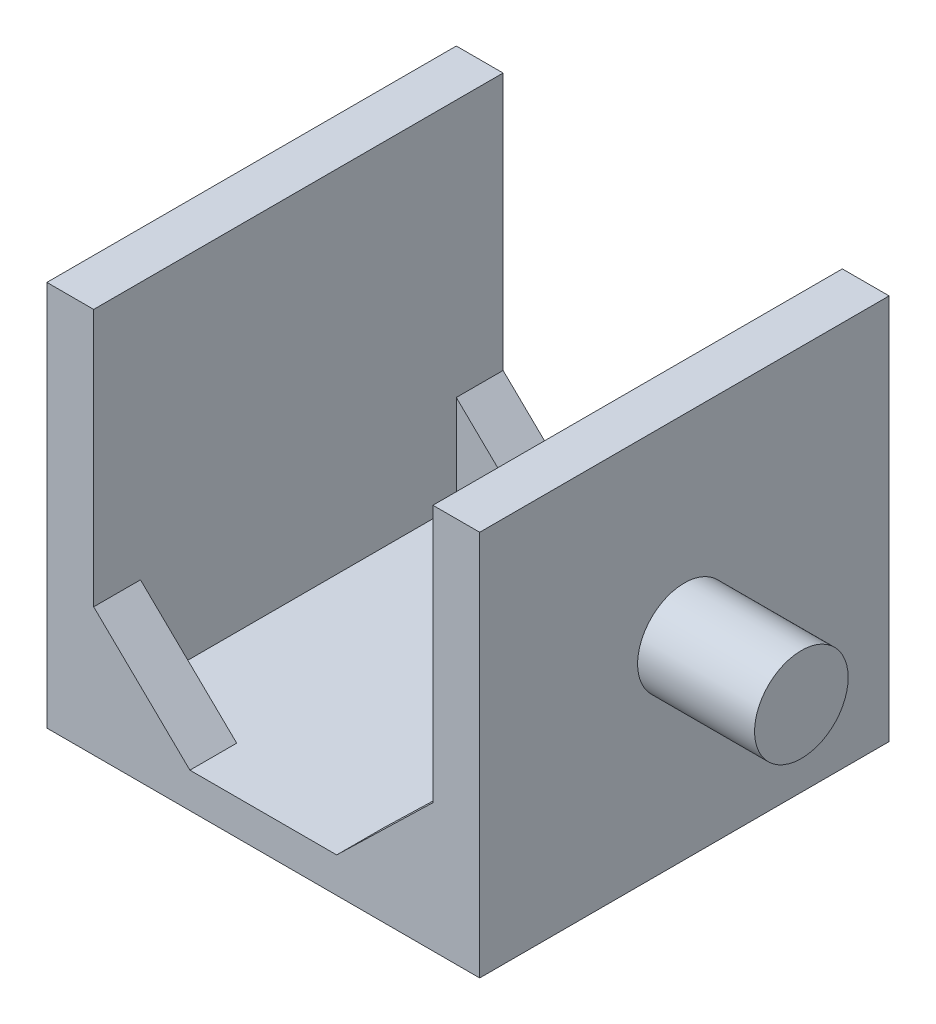
ISO-10303-21;
HEADER;
FILE_DESCRIPTION(('STEP AP214'),'2;1');
FILE_NAME('part.step','',(''),(''),'','','');
FILE_SCHEMA(('AUTOMOTIVE_DESIGN { 1 0 10303 214 1 1 1 1 }'));
ENDSEC;
DATA;
#1=APPLICATION_CONTEXT('core data for automotive mechanical design processes');
#2=APPLICATION_PROTOCOL_DEFINITION('international standard','automotive_design',2000,#1);
#3=PRODUCT_CONTEXT('',#1,'mechanical');
#4=PRODUCT('Part','Part','',(#3));
#5=PRODUCT_RELATED_PRODUCT_CATEGORY('part','',(#4));
#6=PRODUCT_DEFINITION_FORMATION('','',#4);
#7=PRODUCT_DEFINITION_CONTEXT('part definition',#1,'design');
#8=PRODUCT_DEFINITION('design','',#6,#7);
#9=PRODUCT_DEFINITION_SHAPE('','',#8);
#10=(LENGTH_UNIT() NAMED_UNIT(*) SI_UNIT(.MILLI.,.METRE.));
#11=(NAMED_UNIT(*) PLANE_ANGLE_UNIT() SI_UNIT($,.RADIAN.));
#12=(NAMED_UNIT(*) SI_UNIT($,.STERADIAN.) SOLID_ANGLE_UNIT());
#13=UNCERTAINTY_MEASURE_WITH_UNIT(LENGTH_MEASURE(1.E-05),#10,'distance_accuracy_value','');
#14=(GEOMETRIC_REPRESENTATION_CONTEXT(3) GLOBAL_UNCERTAINTY_ASSIGNED_CONTEXT((#13)) GLOBAL_UNIT_ASSIGNED_CONTEXT((#10,
#11,#12)) REPRESENTATION_CONTEXT('',''));
#15=CARTESIAN_POINT('',(0.,0.,0.));
#16=DIRECTION('',(0.,0.,1.));
#17=DIRECTION('',(1.,0.,0.));
#18=AXIS2_PLACEMENT_3D('',#15,#16,#17);
#19=CARTESIAN_POINT('',(0.,3.,0.));
#20=DIRECTION('',(0.,-1.,0.));
#21=DIRECTION('',(0.,0.,-1.));
#22=AXIS2_PLACEMENT_3D('',#19,#20,#21);
#23=PLANE('',#22);
#24=CARTESIAN_POINT('',(0.,3.,0.));
#25=DIRECTION('',(0.,1.,0.));
#26=DIRECTION('',(0.,0.,1.));
#27=AXIS2_PLACEMENT_3D('',#24,#25,#26);
#28=CIRCLE('',#27,2.);
#29=CARTESIAN_POINT('',(0.,3.,2.));
#30=VERTEX_POINT('',#29);
#31=EDGE_CURVE('E311',#30,#30,#28,.T.);
#32=ORIENTED_EDGE('',*,*,#31,.F.);
#33=EDGE_LOOP('',(#32));
#34=FACE_BOUND('',#33,.T.);
#35=DIRECTION('',(-1.,0.,0.));
#36=VECTOR('',#35,1.);
#37=CARTESIAN_POINT('',(6.27292779435015,3.,-13.5));
#38=LINE('',#37,#36);
#39=CARTESIAN_POINT('',(14.5,3.,-13.5));
#40=VERTEX_POINT('',#39);
#41=CARTESIAN_POINT('',(6.27292779435015,3.,-13.5));
#42=VERTEX_POINT('',#41);
#43=EDGE_CURVE('E61',#40,#42,#38,.T.);
#44=ORIENTED_EDGE('',*,*,#43,.T.);
#45=DIRECTION('',(0.,0.,-1.));
#46=VECTOR('',#45,1.);
#47=CARTESIAN_POINT('',(6.27292779435015,3.,-13.5));
#48=LINE('',#47,#46);
#49=CARTESIAN_POINT('',(6.27292779435015,3.,-17.5));
#50=VERTEX_POINT('',#49);
#51=EDGE_CURVE('E174',#42,#50,#48,.T.);
#52=ORIENTED_EDGE('',*,*,#51,.T.);
#53=DIRECTION('',(-1.,0.,0.));
#54=VECTOR('',#53,1.);
#55=CARTESIAN_POINT('',(-18.5,3.,-17.5));
#56=LINE('',#55,#54);
#57=CARTESIAN_POINT('',(-6.27292779435015,3.,-17.5));
#58=VERTEX_POINT('',#57);
#59=EDGE_CURVE('E161',#50,#58,#56,.T.);
#60=ORIENTED_EDGE('',*,*,#59,.T.);
#61=DIRECTION('',(0.,0.,-1.));
#62=VECTOR('',#61,1.);
#63=CARTESIAN_POINT('',(-6.27292779435015,3.,-13.5));
#64=LINE('',#63,#62);
#65=CARTESIAN_POINT('',(-6.27292779435015,3.,-13.5));
#66=VERTEX_POINT('',#65);
#67=EDGE_CURVE('E204',#66,#58,#64,.T.);
#68=ORIENTED_EDGE('',*,*,#67,.F.);
#69=DIRECTION('',(1.,0.,0.));
#70=VECTOR('',#69,1.);
#71=CARTESIAN_POINT('',(-6.27292779435015,3.,-13.5));
#72=LINE('',#71,#70);
#73=CARTESIAN_POINT('',(-14.5,3.,-13.5));
#74=VERTEX_POINT('',#73);
#75=EDGE_CURVE('E198',#74,#66,#72,.T.);
#76=ORIENTED_EDGE('',*,*,#75,.F.);
#77=DIRECTION('',(0.,0.,-1.));
#78=VECTOR('',#77,1.);
#79=CARTESIAN_POINT('',(-14.5,3.,-17.5));
#80=LINE('',#79,#78);
#81=CARTESIAN_POINT('',(-14.5,3.,13.5));
#82=VERTEX_POINT('',#81);
#83=EDGE_CURVE('E273',#82,#74,#80,.T.);
#84=ORIENTED_EDGE('',*,*,#83,.F.);
#85=DIRECTION('',(1.,0.,0.));
#86=VECTOR('',#85,1.);
#87=CARTESIAN_POINT('',(-6.27292779435015,3.,13.5));
#88=LINE('',#87,#86);
#89=CARTESIAN_POINT('',(-6.27292779435015,3.,13.5));
#90=VERTEX_POINT('',#89);
#91=EDGE_CURVE('E234',#82,#90,#88,.T.);
#92=ORIENTED_EDGE('',*,*,#91,.T.);
#93=DIRECTION('',(0.,0.,1.));
#94=VECTOR('',#93,1.);
#95=CARTESIAN_POINT('',(-6.27292779435015,3.,13.5));
#96=LINE('',#95,#94);
#97=CARTESIAN_POINT('',(-6.27292779435015,3.,17.5));
#98=VERTEX_POINT('',#97);
#99=EDGE_CURVE('E241',#90,#98,#96,.T.);
#100=ORIENTED_EDGE('',*,*,#99,.T.);
#101=DIRECTION('',(1.,0.,0.));
#102=VECTOR('',#101,1.);
#103=CARTESIAN_POINT('',(-18.5,3.,17.5));
#104=LINE('',#103,#102);
#105=CARTESIAN_POINT('',(6.27292779435015,3.,17.5));
#106=VERTEX_POINT('',#105);
#107=EDGE_CURVE('E171',#98,#106,#104,.T.);
#108=ORIENTED_EDGE('',*,*,#107,.T.);
#109=DIRECTION('',(0.,0.,1.));
#110=VECTOR('',#109,1.);
#111=CARTESIAN_POINT('',(6.27292779435015,3.,13.5));
#112=LINE('',#111,#110);
#113=CARTESIAN_POINT('',(6.27292779435015,3.,13.5));
#114=VERTEX_POINT('',#113);
#115=EDGE_CURVE('E224',#114,#106,#112,.T.);
#116=ORIENTED_EDGE('',*,*,#115,.F.);
#117=DIRECTION('',(-1.,0.,0.));
#118=VECTOR('',#117,1.);
#119=CARTESIAN_POINT('',(6.27292779435015,3.,13.5));
#120=LINE('',#119,#118);
#121=CARTESIAN_POINT('',(14.5,3.,13.5));
#122=VERTEX_POINT('',#121);
#123=EDGE_CURVE('E218',#122,#114,#120,.T.);
#124=ORIENTED_EDGE('',*,*,#123,.F.);
#125=DIRECTION('',(0.,0.,1.));
#126=VECTOR('',#125,1.);
#127=CARTESIAN_POINT('',(14.5,3.,-17.5));
#128=LINE('',#127,#126);
#129=EDGE_CURVE('E270',#40,#122,#128,.T.);
#130=ORIENTED_EDGE('',*,*,#129,.F.);
#131=EDGE_LOOP('',(#44,#52,#60,#68,#76,#84,#92,#100,#108,#116,#124,#130));
#132=FACE_BOUND('',#131,.T.);
#133=ADVANCED_FACE('F43',(#34,#132),#23,.F.);
#134=CARTESIAN_POINT('',(-14.5,33.,-17.5));
#135=DIRECTION('',(-1.,0.,0.));
#136=DIRECTION('',(0.,0.,1.));
#137=AXIS2_PLACEMENT_3D('',#134,#135,#136);
#138=PLANE('',#137);
#139=DIRECTION('',(0.,0.,-1.));
#140=VECTOR('',#139,1.);
#141=CARTESIAN_POINT('',(-14.5,10.9791104783965,-13.5));
#142=LINE('',#141,#140);
#143=CARTESIAN_POINT('',(-14.5,10.9791104783965,-13.5));
#144=VERTEX_POINT('',#143);
#145=CARTESIAN_POINT('',(-14.5,10.9791104783965,-17.5));
#146=VERTEX_POINT('',#145);
#147=EDGE_CURVE('E201',#144,#146,#142,.T.);
#148=ORIENTED_EDGE('',*,*,#147,.T.);
#149=DIRECTION('',(0.,-1.,0.));
#150=VECTOR('',#149,1.);
#151=CARTESIAN_POINT('',(-14.5,33.,-17.5));
#152=LINE('',#151,#150);
#153=CARTESIAN_POINT('',(-14.5,33.,-17.5));
#154=VERTEX_POINT('',#153);
#155=EDGE_CURVE('E301',#154,#146,#152,.T.);
#156=ORIENTED_EDGE('',*,*,#155,.F.);
#157=DIRECTION('',(0.,0.,-1.));
#158=VECTOR('',#157,1.);
#159=CARTESIAN_POINT('',(-14.5,33.,-17.5));
#160=LINE('',#159,#158);
#161=CARTESIAN_POINT('',(-14.5,33.,17.5));
#162=VERTEX_POINT('',#161);
#163=EDGE_CURVE('E294',#162,#154,#160,.T.);
#164=ORIENTED_EDGE('',*,*,#163,.F.);
#165=DIRECTION('',(0.,-1.,0.));
#166=VECTOR('',#165,1.);
#167=CARTESIAN_POINT('',(-14.5,33.,17.5));
#168=LINE('',#167,#166);
#169=CARTESIAN_POINT('',(-14.5,10.9791104783965,17.5));
#170=VERTEX_POINT('',#169);
#171=EDGE_CURVE('E307',#162,#170,#168,.T.);
#172=ORIENTED_EDGE('',*,*,#171,.T.);
#173=DIRECTION('',(0.,0.,1.));
#174=VECTOR('',#173,1.);
#175=CARTESIAN_POINT('',(-14.5,10.9791104783965,13.5));
#176=LINE('',#175,#174);
#177=CARTESIAN_POINT('',(-14.5,10.9791104783965,13.5));
#178=VERTEX_POINT('',#177);
#179=EDGE_CURVE('E245',#178,#170,#176,.T.);
#180=ORIENTED_EDGE('',*,*,#179,.F.);
#181=DIRECTION('',(0.,-1.,0.));
#182=VECTOR('',#181,1.);
#183=CARTESIAN_POINT('',(-14.5,3.,13.5));
#184=LINE('',#183,#182);
#185=EDGE_CURVE('E231',#178,#82,#184,.T.);
#186=ORIENTED_EDGE('',*,*,#185,.T.);
#187=ORIENTED_EDGE('',*,*,#83,.T.);
#188=DIRECTION('',(0.,-1.,0.));
#189=VECTOR('',#188,1.);
#190=CARTESIAN_POINT('',(-14.5,3.,-13.5));
#191=LINE('',#190,#189);
#192=EDGE_CURVE('E192',#144,#74,#191,.T.);
#193=ORIENTED_EDGE('',*,*,#192,.F.);
#194=EDGE_LOOP('',(#148,#156,#164,#172,#180,#186,#187,#193));
#195=FACE_BOUND('',#194,.T.);
#196=ADVANCED_FACE('F368',(#195),#138,.F.);
#197=CARTESIAN_POINT('',(14.5,33.,-17.5));
#198=DIRECTION('',(1.,0.,0.));
#199=DIRECTION('',(0.,0.,-1.));
#200=AXIS2_PLACEMENT_3D('',#197,#198,#199);
#201=PLANE('',#200);
#202=DIRECTION('',(0.,-1.,0.));
#203=VECTOR('',#202,1.);
#204=CARTESIAN_POINT('',(14.5,33.,-17.5));
#205=LINE('',#204,#203);
#206=CARTESIAN_POINT('',(14.5,33.,-17.5));
#207=VERTEX_POINT('',#206);
#208=CARTESIAN_POINT('',(14.5,10.9791104783965,-17.5));
#209=VERTEX_POINT('',#208);
#210=EDGE_CURVE('E259',#207,#209,#205,.T.);
#211=ORIENTED_EDGE('',*,*,#210,.T.);
#212=DIRECTION('',(0.,0.,-1.));
#213=VECTOR('',#212,1.);
#214=CARTESIAN_POINT('',(14.5,10.9791104783965,-13.5));
#215=LINE('',#214,#213);
#216=CARTESIAN_POINT('',(14.5,10.9791104783965,-13.5));
#217=VERTEX_POINT('',#216);
#218=EDGE_CURVE('E69',#217,#209,#215,.T.);
#219=ORIENTED_EDGE('',*,*,#218,.F.);
#220=DIRECTION('',(0.,-1.,0.));
#221=VECTOR('',#220,1.);
#222=CARTESIAN_POINT('',(14.5,3.,-13.5));
#223=LINE('',#222,#221);
#224=EDGE_CURVE('E183',#217,#40,#223,.T.);
#225=ORIENTED_EDGE('',*,*,#224,.T.);
#226=ORIENTED_EDGE('',*,*,#129,.T.);
#227=DIRECTION('',(0.,-1.,0.));
#228=VECTOR('',#227,1.);
#229=CARTESIAN_POINT('',(14.5,3.,13.5));
#230=LINE('',#229,#228);
#231=CARTESIAN_POINT('',(14.5,10.9791104783965,13.5));
#232=VERTEX_POINT('',#231);
#233=EDGE_CURVE('E211',#232,#122,#230,.T.);
#234=ORIENTED_EDGE('',*,*,#233,.F.);
#235=DIRECTION('',(0.,0.,1.));
#236=VECTOR('',#235,1.);
#237=CARTESIAN_POINT('',(14.5,10.9791104783965,13.5));
#238=LINE('',#237,#236);
#239=CARTESIAN_POINT('',(14.5,10.9791104783965,17.5));
#240=VERTEX_POINT('',#239);
#241=EDGE_CURVE('E221',#232,#240,#238,.T.);
#242=ORIENTED_EDGE('',*,*,#241,.T.);
#243=DIRECTION('',(0.,-1.,0.));
#244=VECTOR('',#243,1.);
#245=CARTESIAN_POINT('',(14.5,33.,17.5));
#246=LINE('',#245,#244);
#247=CARTESIAN_POINT('',(14.5,33.,17.5));
#248=VERTEX_POINT('',#247);
#249=EDGE_CURVE('E265',#248,#240,#246,.T.);
#250=ORIENTED_EDGE('',*,*,#249,.F.);
#251=DIRECTION('',(0.,0.,1.));
#252=VECTOR('',#251,1.);
#253=CARTESIAN_POINT('',(14.5,33.,-17.5));
#254=LINE('',#253,#252);
#255=EDGE_CURVE('E278',#207,#248,#254,.T.);
#256=ORIENTED_EDGE('',*,*,#255,.F.);
#257=EDGE_LOOP('',(#211,#219,#225,#226,#234,#242,#250,#256));
#258=FACE_BOUND('',#257,.T.);
#259=ADVANCED_FACE('F395',(#258),#201,.F.);
#260=CARTESIAN_POINT('',(0.,0.,0.));
#261=DIRECTION('',(0.,-1.,0.));
#262=DIRECTION('',(0.,0.,-1.));
#263=AXIS2_PLACEMENT_3D('',#260,#261,#262);
#264=PLANE('',#263);
#265=DIRECTION('',(0.,0.,-1.));
#266=VECTOR('',#265,1.);
#267=CARTESIAN_POINT('',(18.5,0.,17.5));
#268=LINE('',#267,#266);
#269=CARTESIAN_POINT('',(18.5,0.,17.5));
#270=VERTEX_POINT('',#269);
#271=CARTESIAN_POINT('',(18.5,0.,-17.5));
#272=VERTEX_POINT('',#271);
#273=EDGE_CURVE('E315',#270,#272,#268,.T.);
#274=ORIENTED_EDGE('',*,*,#273,.F.);
#275=DIRECTION('',(1.,0.,0.));
#276=VECTOR('',#275,1.);
#277=CARTESIAN_POINT('',(-18.5,0.,17.5));
#278=LINE('',#277,#276);
#279=CARTESIAN_POINT('',(-18.5,0.,17.5));
#280=VERTEX_POINT('',#279);
#281=EDGE_CURVE('E172',#280,#270,#278,.T.);
#282=ORIENTED_EDGE('',*,*,#281,.F.);
#283=DIRECTION('',(0.,0.,1.));
#284=VECTOR('',#283,1.);
#285=CARTESIAN_POINT('',(-18.5,0.,17.5));
#286=LINE('',#285,#284);
#287=CARTESIAN_POINT('',(-18.5,0.,-17.5));
#288=VERTEX_POINT('',#287);
#289=EDGE_CURVE('E329',#288,#280,#286,.T.);
#290=ORIENTED_EDGE('',*,*,#289,.F.);
#291=DIRECTION('',(-1.,0.,0.));
#292=VECTOR('',#291,1.);
#293=CARTESIAN_POINT('',(-18.5,0.,-17.5));
#294=LINE('',#293,#292);
#295=EDGE_CURVE('E326',#272,#288,#294,.T.);
#296=ORIENTED_EDGE('',*,*,#295,.F.);
#297=EDGE_LOOP('',(#274,#282,#290,#296));
#298=FACE_BOUND('',#297,.T.);
#299=CARTESIAN_POINT('',(0.,0.,0.));
#300=DIRECTION('',(0.,1.,0.));
#301=DIRECTION('',(0.,0.,1.));
#302=AXIS2_PLACEMENT_3D('',#299,#300,#301);
#303=CIRCLE('',#302,2.);
#304=CARTESIAN_POINT('',(0.,0.,2.));
#305=VERTEX_POINT('',#304);
#306=EDGE_CURVE('E310',#305,#305,#303,.T.);
#307=ORIENTED_EDGE('',*,*,#306,.T.);
#308=EDGE_LOOP('',(#307));
#309=FACE_BOUND('',#308,.T.);
#310=ADVANCED_FACE('F354',(#298,#309),#264,.T.);
#311=CARTESIAN_POINT('',(18.5,3.,17.5));
#312=DIRECTION('',(-1.,0.,0.));
#313=DIRECTION('',(0.,0.,1.));
#314=AXIS2_PLACEMENT_3D('',#311,#312,#313);
#315=PLANE('',#314);
#316=CARTESIAN_POINT('',(18.5,16.5,0.));
#317=DIRECTION('',(1.,0.,0.));
#318=DIRECTION('',(0.,0.,-1.));
#319=AXIS2_PLACEMENT_3D('',#316,#317,#318);
#320=CIRCLE('',#319,4.);
#321=CARTESIAN_POINT('',(18.5,16.5,-4.));
#322=VERTEX_POINT('',#321);
#323=EDGE_CURVE('E11',#322,#322,#320,.T.);
#324=ORIENTED_EDGE('',*,*,#323,.F.);
#325=EDGE_LOOP('',(#324));
#326=FACE_BOUND('',#325,.T.);
#327=ORIENTED_EDGE('',*,*,#273,.T.);
#328=DIRECTION('',(0.,-1.,0.));
#329=VECTOR('',#328,1.);
#330=CARTESIAN_POINT('',(18.5,3.,-17.5));
#331=LINE('',#330,#329);
#332=CARTESIAN_POINT('',(18.5,33.,-17.5));
#333=VERTEX_POINT('',#332);
#334=EDGE_CURVE('E47',#333,#272,#331,.T.);
#335=ORIENTED_EDGE('',*,*,#334,.F.);
#336=DIRECTION('',(0.,0.,-1.));
#337=VECTOR('',#336,1.);
#338=CARTESIAN_POINT('',(18.5,33.,-17.5));
#339=LINE('',#338,#337);
#340=CARTESIAN_POINT('',(18.5,33.,17.5));
#341=VERTEX_POINT('',#340);
#342=EDGE_CURVE('E274',#341,#333,#339,.T.);
#343=ORIENTED_EDGE('',*,*,#342,.F.);
#344=DIRECTION('',(0.,-1.,0.));
#345=VECTOR('',#344,1.);
#346=CARTESIAN_POINT('',(18.5,3.,17.5));
#347=LINE('',#346,#345);
#348=EDGE_CURVE('E322',#341,#270,#347,.T.);
#349=ORIENTED_EDGE('',*,*,#348,.T.);
#350=EDGE_LOOP('',(#327,#335,#343,#349));
#351=FACE_BOUND('',#350,.T.);
#352=ADVANCED_FACE('F45',(#326,#351),#315,.F.);
#353=CARTESIAN_POINT('',(-18.5,3.,-17.5));
#354=DIRECTION('',(0.,0.,1.));
#355=DIRECTION('',(1.,0.,0.));
#356=AXIS2_PLACEMENT_3D('',#353,#354,#355);
#357=PLANE('',#356);
#358=DIRECTION('',(-0.717841806418926,0.696206248863951,0.));
#359=VECTOR('',#358,1.);
#360=CARTESIAN_POINT('',(-14.5,10.9791104783965,-17.5));
#361=LINE('',#360,#359);
#362=EDGE_CURVE('E167',#58,#146,#361,.T.);
#363=ORIENTED_EDGE('',*,*,#362,.F.);
#364=ORIENTED_EDGE('',*,*,#59,.F.);
#365=DIRECTION('',(0.717841806418926,0.696206248863951,0.));
#366=VECTOR('',#365,1.);
#367=CARTESIAN_POINT('',(14.5,10.9791104783965,-17.5));
#368=LINE('',#367,#366);
#369=EDGE_CURVE('E165',#50,#209,#368,.T.);
#370=ORIENTED_EDGE('',*,*,#369,.T.);
#371=ORIENTED_EDGE('',*,*,#210,.F.);
#372=DIRECTION('',(-1.,0.,0.));
#373=VECTOR('',#372,1.);
#374=CARTESIAN_POINT('',(18.5,33.,-17.5));
#375=LINE('',#374,#373);
#376=EDGE_CURVE('E281',#333,#207,#375,.T.);
#377=ORIENTED_EDGE('',*,*,#376,.F.);
#378=ORIENTED_EDGE('',*,*,#334,.T.);
#379=ORIENTED_EDGE('',*,*,#295,.T.);
#380=DIRECTION('',(0.,-1.,0.));
#381=VECTOR('',#380,1.);
#382=CARTESIAN_POINT('',(-18.5,3.,-17.5));
#383=LINE('',#382,#381);
#384=CARTESIAN_POINT('',(-18.5,33.,-17.5));
#385=VERTEX_POINT('',#384);
#386=EDGE_CURVE('E340',#385,#288,#383,.T.);
#387=ORIENTED_EDGE('',*,*,#386,.F.);
#388=DIRECTION('',(-1.,0.,0.));
#389=VECTOR('',#388,1.);
#390=CARTESIAN_POINT('',(-18.5,33.,-17.5));
#391=LINE('',#390,#389);
#392=EDGE_CURVE('E297',#154,#385,#391,.T.);
#393=ORIENTED_EDGE('',*,*,#392,.F.);
#394=ORIENTED_EDGE('',*,*,#155,.T.);
#395=EDGE_LOOP('',(#363,#364,#370,#371,#377,#378,#379,#387,#393,#394));
#396=FACE_BOUND('',#395,.T.);
#397=ADVANCED_FACE('F162',(#396),#357,.F.);
#398=CARTESIAN_POINT('',(-18.5,3.,17.5));
#399=DIRECTION('',(1.,0.,0.));
#400=DIRECTION('',(0.,0.,-1.));
#401=AXIS2_PLACEMENT_3D('',#398,#399,#400);
#402=PLANE('',#401);
#403=CARTESIAN_POINT('',(-18.5,16.5,0.));
#404=DIRECTION('',(-1.,0.,0.));
#405=DIRECTION('',(0.,0.,1.));
#406=AXIS2_PLACEMENT_3D('',#403,#404,#405);
#407=CIRCLE('',#406,4.);
#408=CARTESIAN_POINT('',(-18.5,16.5,4.));
#409=VERTEX_POINT('',#408);
#410=EDGE_CURVE('E53',#409,#409,#407,.T.);
#411=ORIENTED_EDGE('',*,*,#410,.F.);
#412=EDGE_LOOP('',(#411));
#413=FACE_BOUND('',#412,.T.);
#414=ORIENTED_EDGE('',*,*,#289,.T.);
#415=DIRECTION('',(0.,-1.,0.));
#416=VECTOR('',#415,1.);
#417=CARTESIAN_POINT('',(-18.5,3.,17.5));
#418=LINE('',#417,#416);
#419=CARTESIAN_POINT('',(-18.5,33.,17.5));
#420=VERTEX_POINT('',#419);
#421=EDGE_CURVE('E337',#420,#280,#418,.T.);
#422=ORIENTED_EDGE('',*,*,#421,.F.);
#423=DIRECTION('',(0.,0.,1.));
#424=VECTOR('',#423,1.);
#425=CARTESIAN_POINT('',(-18.5,33.,-17.5));
#426=LINE('',#425,#424);
#427=EDGE_CURVE('E287',#385,#420,#426,.T.);
#428=ORIENTED_EDGE('',*,*,#427,.F.);
#429=ORIENTED_EDGE('',*,*,#386,.T.);
#430=EDGE_LOOP('',(#414,#422,#428,#429));
#431=FACE_BOUND('',#430,.T.);
#432=ADVANCED_FACE('F356',(#413,#431),#402,.F.);
#433=CARTESIAN_POINT('',(-18.5,3.,17.5));
#434=DIRECTION('',(0.,0.,-1.));
#435=DIRECTION('',(-1.,0.,0.));
#436=AXIS2_PLACEMENT_3D('',#433,#434,#435);
#437=PLANE('',#436);
#438=DIRECTION('',(0.717841806418926,0.696206248863951,0.));
#439=VECTOR('',#438,1.);
#440=CARTESIAN_POINT('',(14.5,10.9791104783965,17.5));
#441=LINE('',#440,#439);
#442=EDGE_CURVE('E207',#106,#240,#441,.T.);
#443=ORIENTED_EDGE('',*,*,#442,.F.);
#444=ORIENTED_EDGE('',*,*,#107,.F.);
#445=DIRECTION('',(-0.717841806418926,0.696206248863951,0.));
#446=VECTOR('',#445,1.);
#447=CARTESIAN_POINT('',(-14.5,10.9791104783965,17.5));
#448=LINE('',#447,#446);
#449=EDGE_CURVE('E227',#98,#170,#448,.T.);
#450=ORIENTED_EDGE('',*,*,#449,.T.);
#451=ORIENTED_EDGE('',*,*,#171,.F.);
#452=DIRECTION('',(1.,0.,0.));
#453=VECTOR('',#452,1.);
#454=CARTESIAN_POINT('',(-18.5,33.,17.5));
#455=LINE('',#454,#453);
#456=EDGE_CURVE('E291',#420,#162,#455,.T.);
#457=ORIENTED_EDGE('',*,*,#456,.F.);
#458=ORIENTED_EDGE('',*,*,#421,.T.);
#459=ORIENTED_EDGE('',*,*,#281,.T.);
#460=ORIENTED_EDGE('',*,*,#348,.F.);
#461=DIRECTION('',(1.,0.,0.));
#462=VECTOR('',#461,1.);
#463=CARTESIAN_POINT('',(18.5,33.,17.5));
#464=LINE('',#463,#462);
#465=EDGE_CURVE('E269',#248,#341,#464,.T.);
#466=ORIENTED_EDGE('',*,*,#465,.F.);
#467=ORIENTED_EDGE('',*,*,#249,.T.);
#468=EDGE_LOOP('',(#443,#444,#450,#451,#457,#458,#459,#460,#466,#467));
#469=FACE_BOUND('',#468,.T.);
#470=ADVANCED_FACE('F360',(#469),#437,.F.);
#471=CARTESIAN_POINT('',(0.,3.,0.));
#472=DIRECTION('',(0.,-1.,0.));
#473=DIRECTION('',(0.,0.,-1.));
#474=AXIS2_PLACEMENT_3D('',#471,#472,#473);
#475=CYLINDRICAL_SURFACE('',#474,2.);
#476=ORIENTED_EDGE('',*,*,#31,.T.);
#477=EDGE_LOOP('',(#476));
#478=FACE_BOUND('',#477,.T.);
#479=ORIENTED_EDGE('',*,*,#306,.F.);
#480=EDGE_LOOP('',(#479));
#481=FACE_BOUND('',#480,.T.);
#482=ADVANCED_FACE('F421',(#478,#481),#475,.F.);
#483=CARTESIAN_POINT('',(0.,33.,0.));
#484=DIRECTION('',(0.,1.,0.));
#485=DIRECTION('',(0.,0.,1.));
#486=AXIS2_PLACEMENT_3D('',#483,#484,#485);
#487=PLANE('',#486);
#488=ORIENTED_EDGE('',*,*,#427,.T.);
#489=ORIENTED_EDGE('',*,*,#456,.T.);
#490=ORIENTED_EDGE('',*,*,#163,.T.);
#491=ORIENTED_EDGE('',*,*,#392,.T.);
#492=EDGE_LOOP('',(#488,#489,#490,#491));
#493=FACE_BOUND('',#492,.T.);
#494=ADVANCED_FACE('F364',(#493),#487,.T.);
#495=CARTESIAN_POINT('',(0.,33.,0.));
#496=DIRECTION('',(0.,-1.,0.));
#497=DIRECTION('',(0.,0.,-1.));
#498=AXIS2_PLACEMENT_3D('',#495,#496,#497);
#499=PLANE('',#498);
#500=ORIENTED_EDGE('',*,*,#342,.T.);
#501=ORIENTED_EDGE('',*,*,#376,.T.);
#502=ORIENTED_EDGE('',*,*,#255,.T.);
#503=ORIENTED_EDGE('',*,*,#465,.T.);
#504=EDGE_LOOP('',(#500,#501,#502,#503));
#505=FACE_BOUND('',#504,.T.);
#506=ADVANCED_FACE('F457',(#505),#499,.F.);
#507=CARTESIAN_POINT('',(-26.5,16.5,0.));
#508=DIRECTION('',(1.,0.,0.));
#509=DIRECTION('',(0.,0.,-1.));
#510=AXIS2_PLACEMENT_3D('',#507,#508,#509);
#511=CYLINDRICAL_SURFACE('',#510,4.);
#512=CARTESIAN_POINT('',(-26.5,16.5,0.));
#513=DIRECTION('',(-1.,0.,0.));
#514=DIRECTION('',(0.,0.,1.));
#515=AXIS2_PLACEMENT_3D('',#512,#513,#514);
#516=CIRCLE('',#515,4.);
#517=CARTESIAN_POINT('',(-26.5,16.5,4.));
#518=VERTEX_POINT('',#517);
#519=EDGE_CURVE('E254',#518,#518,#516,.T.);
#520=ORIENTED_EDGE('',*,*,#519,.F.);
#521=EDGE_LOOP('',(#520));
#522=FACE_BOUND('',#521,.T.);
#523=ORIENTED_EDGE('',*,*,#410,.T.);
#524=EDGE_LOOP('',(#523));
#525=FACE_BOUND('',#524,.T.);
#526=ADVANCED_FACE('F449',(#522,#525),#511,.T.);
#527=CARTESIAN_POINT('',(-26.5,16.5,0.));
#528=DIRECTION('',(-1.,0.,0.));
#529=DIRECTION('',(0.,0.,1.));
#530=AXIS2_PLACEMENT_3D('',#527,#528,#529);
#531=PLANE('',#530);
#532=ORIENTED_EDGE('',*,*,#519,.T.);
#533=EDGE_LOOP('',(#532));
#534=FACE_BOUND('',#533,.T.);
#535=ADVANCED_FACE('F440',(#534),#531,.T.);
#536=CARTESIAN_POINT('',(28.5,16.5,0.));
#537=DIRECTION('',(-1.,0.,0.));
#538=DIRECTION('',(0.,0.,1.));
#539=AXIS2_PLACEMENT_3D('',#536,#537,#538);
#540=CYLINDRICAL_SURFACE('',#539,4.);
#541=CARTESIAN_POINT('',(28.5,16.5,0.));
#542=DIRECTION('',(1.,0.,0.));
#543=DIRECTION('',(0.,0.,-1.));
#544=AXIS2_PLACEMENT_3D('',#541,#542,#543);
#545=CIRCLE('',#544,4.);
#546=CARTESIAN_POINT('',(28.5,16.5,-4.));
#547=VERTEX_POINT('',#546);
#548=EDGE_CURVE('E249',#547,#547,#545,.T.);
#549=ORIENTED_EDGE('',*,*,#548,.F.);
#550=EDGE_LOOP('',(#549));
#551=FACE_BOUND('',#550,.T.);
#552=ORIENTED_EDGE('',*,*,#323,.T.);
#553=EDGE_LOOP('',(#552));
#554=FACE_BOUND('',#553,.T.);
#555=ADVANCED_FACE('F437',(#551,#554),#540,.T.);
#556=CARTESIAN_POINT('',(28.5,16.5,0.));
#557=DIRECTION('',(1.,0.,0.));
#558=DIRECTION('',(0.,0.,-1.));
#559=AXIS2_PLACEMENT_3D('',#556,#557,#558);
#560=PLANE('',#559);
#561=ORIENTED_EDGE('',*,*,#548,.T.);
#562=EDGE_LOOP('',(#561));
#563=FACE_BOUND('',#562,.T.);
#564=ADVANCED_FACE('F439',(#563),#560,.T.);
#565=CARTESIAN_POINT('',(-14.5,10.9791104783965,13.5));
#566=DIRECTION('',(0.696206248863951,0.717841806418926,0.));
#567=DIRECTION('',(-0.717841806418926,0.696206248863951,0.));
#568=AXIS2_PLACEMENT_3D('',#565,#566,#567);
#569=PLANE('',#568);
#570=ORIENTED_EDGE('',*,*,#449,.F.);
#571=ORIENTED_EDGE('',*,*,#99,.F.);
#572=DIRECTION('',(-0.717841806418926,0.696206248863951,0.));
#573=VECTOR('',#572,1.);
#574=CARTESIAN_POINT('',(-14.5,10.9791104783965,13.5));
#575=LINE('',#574,#573);
#576=EDGE_CURVE('E237',#90,#178,#575,.T.);
#577=ORIENTED_EDGE('',*,*,#576,.T.);
#578=ORIENTED_EDGE('',*,*,#179,.T.);
#579=EDGE_LOOP('',(#570,#571,#577,#578));
#580=FACE_BOUND('',#579,.T.);
#581=ADVANCED_FACE('F385',(#580),#569,.T.);
#582=CARTESIAN_POINT('',(0.,0.,13.5));
#583=DIRECTION('',(0.,0.,1.));
#584=DIRECTION('',(1.,0.,0.));
#585=AXIS2_PLACEMENT_3D('',#582,#583,#584);
#586=PLANE('',#585);
#587=ORIENTED_EDGE('',*,*,#185,.F.);
#588=ORIENTED_EDGE('',*,*,#576,.F.);
#589=ORIENTED_EDGE('',*,*,#91,.F.);
#590=EDGE_LOOP('',(#587,#588,#589));
#591=FACE_BOUND('',#590,.T.);
#592=ADVANCED_FACE('F381',(#591),#586,.F.);
#593=CARTESIAN_POINT('',(14.5,10.9791104783965,13.5));
#594=DIRECTION('',(0.696206248863951,-0.717841806418926,0.));
#595=DIRECTION('',(0.717841806418926,0.696206248863951,0.));
#596=AXIS2_PLACEMENT_3D('',#593,#594,#595);
#597=PLANE('',#596);
#598=ORIENTED_EDGE('',*,*,#442,.T.);
#599=ORIENTED_EDGE('',*,*,#241,.F.);
#600=DIRECTION('',(0.717841806418926,0.696206248863951,0.));
#601=VECTOR('',#600,1.);
#602=CARTESIAN_POINT('',(14.5,10.9791104783965,13.5));
#603=LINE('',#602,#601);
#604=EDGE_CURVE('E215',#114,#232,#603,.T.);
#605=ORIENTED_EDGE('',*,*,#604,.F.);
#606=ORIENTED_EDGE('',*,*,#115,.T.);
#607=EDGE_LOOP('',(#598,#599,#605,#606));
#608=FACE_BOUND('',#607,.T.);
#609=ADVANCED_FACE('F392',(#608),#597,.F.);
#610=CARTESIAN_POINT('',(0.,0.,13.5));
#611=DIRECTION('',(0.,0.,1.));
#612=DIRECTION('',(-1.,0.,0.));
#613=AXIS2_PLACEMENT_3D('',#610,#611,#612);
#614=PLANE('',#613);
#615=ORIENTED_EDGE('',*,*,#233,.T.);
#616=ORIENTED_EDGE('',*,*,#123,.T.);
#617=ORIENTED_EDGE('',*,*,#604,.T.);
#618=EDGE_LOOP('',(#615,#616,#617));
#619=FACE_BOUND('',#618,.T.);
#620=ADVANCED_FACE('F399',(#619),#614,.F.);
#621=CARTESIAN_POINT('',(-14.5,10.9791104783965,-13.5));
#622=DIRECTION('',(-0.696206248863951,-0.717841806418926,0.));
#623=DIRECTION('',(0.717841806418926,-0.696206248863951,0.));
#624=AXIS2_PLACEMENT_3D('',#621,#622,#623);
#625=PLANE('',#624);
#626=ORIENTED_EDGE('',*,*,#362,.T.);
#627=ORIENTED_EDGE('',*,*,#147,.F.);
#628=DIRECTION('',(-0.717841806418926,0.696206248863951,0.));
#629=VECTOR('',#628,1.);
#630=CARTESIAN_POINT('',(-14.5,10.9791104783965,-13.5));
#631=LINE('',#630,#629);
#632=EDGE_CURVE('E195',#66,#144,#631,.T.);
#633=ORIENTED_EDGE('',*,*,#632,.F.);
#634=ORIENTED_EDGE('',*,*,#67,.T.);
#635=EDGE_LOOP('',(#626,#627,#633,#634));
#636=FACE_BOUND('',#635,.T.);
#637=ADVANCED_FACE('F373',(#636),#625,.F.);
#638=CARTESIAN_POINT('',(0.,0.,-13.5));
#639=DIRECTION('',(0.,0.,-1.));
#640=DIRECTION('',(1.,0.,0.));
#641=AXIS2_PLACEMENT_3D('',#638,#639,#640);
#642=PLANE('',#641);
#643=ORIENTED_EDGE('',*,*,#192,.T.);
#644=ORIENTED_EDGE('',*,*,#75,.T.);
#645=ORIENTED_EDGE('',*,*,#632,.T.);
#646=EDGE_LOOP('',(#643,#644,#645));
#647=FACE_BOUND('',#646,.T.);
#648=ADVANCED_FACE('F409',(#647),#642,.F.);
#649=CARTESIAN_POINT('',(14.5,10.9791104783965,-13.5));
#650=DIRECTION('',(-0.696206248863951,0.717841806418926,0.));
#651=DIRECTION('',(-0.717841806418926,-0.696206248863951,0.));
#652=AXIS2_PLACEMENT_3D('',#649,#650,#651);
#653=PLANE('',#652);
#654=ORIENTED_EDGE('',*,*,#369,.F.);
#655=ORIENTED_EDGE('',*,*,#51,.F.);
#656=DIRECTION('',(0.717841806418926,0.696206248863951,0.));
#657=VECTOR('',#656,1.);
#658=CARTESIAN_POINT('',(14.5,10.9791104783965,-13.5));
#659=LINE('',#658,#657);
#660=EDGE_CURVE('E179',#42,#217,#659,.T.);
#661=ORIENTED_EDGE('',*,*,#660,.T.);
#662=ORIENTED_EDGE('',*,*,#218,.T.);
#663=EDGE_LOOP('',(#654,#655,#661,#662));
#664=FACE_BOUND('',#663,.T.);
#665=ADVANCED_FACE('F181',(#664),#653,.T.);
#666=CARTESIAN_POINT('',(0.,0.,-13.5));
#667=DIRECTION('',(0.,0.,-1.));
#668=DIRECTION('',(-1.,0.,0.));
#669=AXIS2_PLACEMENT_3D('',#666,#667,#668);
#670=PLANE('',#669);
#671=ORIENTED_EDGE('',*,*,#224,.F.);
#672=ORIENTED_EDGE('',*,*,#660,.F.);
#673=ORIENTED_EDGE('',*,*,#43,.F.);
#674=EDGE_LOOP('',(#671,#672,#673));
#675=FACE_BOUND('',#674,.T.);
#676=ADVANCED_FACE('F401',(#675),#670,.F.);
#677=CLOSED_SHELL('',(#133,#196,#259,#310,#352,#397,#432,#470,#482,#494,#506,#526,#535,#555,
#564,#581,#592,#609,#620,#637,#648,#665,#676));
#678=MANIFOLD_SOLID_BREP('B2',#677);
#679=ADVANCED_BREP_SHAPE_REPRESENTATION('',(#18,#678),#14);
#680=SHAPE_DEFINITION_REPRESENTATION(#9,#679);
ENDSEC;
END-ISO-10303-21;
